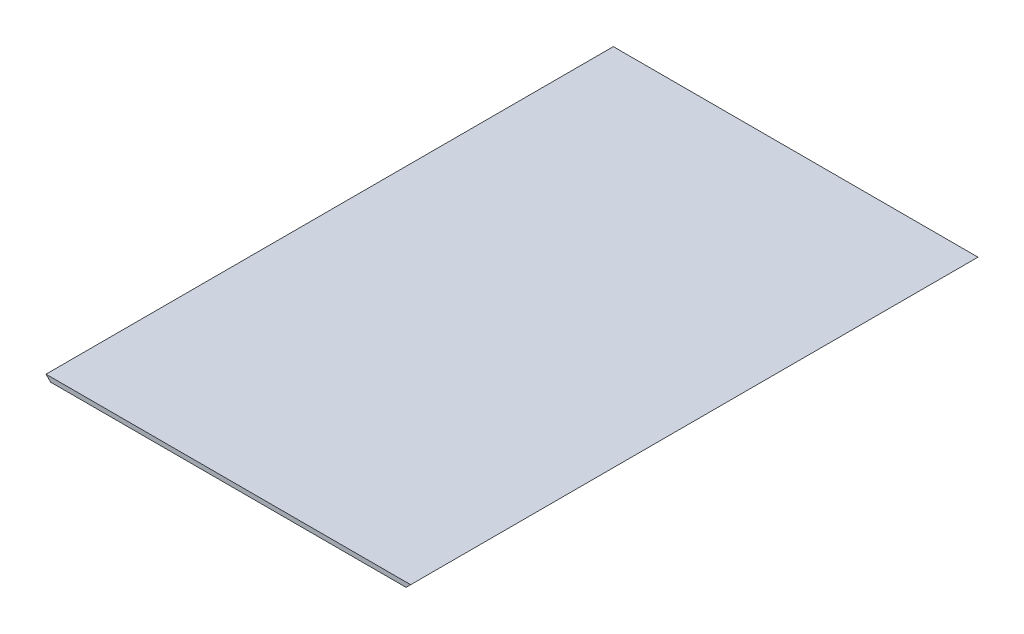
ISO-10303-21;
HEADER;
FILE_DESCRIPTION(('STEP AP214'),'2;1');
FILE_NAME('part.step','',(''),(''),'','','');
FILE_SCHEMA(('AUTOMOTIVE_DESIGN { 1 0 10303 214 1 1 1 1 }'));
ENDSEC;
DATA;
#1=APPLICATION_CONTEXT('core data for automotive mechanical design processes');
#2=APPLICATION_PROTOCOL_DEFINITION('international standard','automotive_design',2000,#1);
#3=PRODUCT_CONTEXT('',#1,'mechanical');
#4=PRODUCT('Part','Part','',(#3));
#5=PRODUCT_RELATED_PRODUCT_CATEGORY('part','',(#4));
#6=PRODUCT_DEFINITION_FORMATION('','',#4);
#7=PRODUCT_DEFINITION_CONTEXT('part definition',#1,'design');
#8=PRODUCT_DEFINITION('design','',#6,#7);
#9=PRODUCT_DEFINITION_SHAPE('','',#8);
#10=(LENGTH_UNIT() NAMED_UNIT(*) SI_UNIT(.MILLI.,.METRE.));
#11=(NAMED_UNIT(*) PLANE_ANGLE_UNIT() SI_UNIT($,.RADIAN.));
#12=(NAMED_UNIT(*) SI_UNIT($,.STERADIAN.) SOLID_ANGLE_UNIT());
#13=UNCERTAINTY_MEASURE_WITH_UNIT(LENGTH_MEASURE(1.E-05),#10,'distance_accuracy_value','');
#14=(GEOMETRIC_REPRESENTATION_CONTEXT(3) GLOBAL_UNCERTAINTY_ASSIGNED_CONTEXT((#13)) GLOBAL_UNIT_ASSIGNED_CONTEXT((#10,
#11,#12)) REPRESENTATION_CONTEXT('',''));
#15=CARTESIAN_POINT('',(0.,0.,0.));
#16=DIRECTION('',(0.,0.,1.));
#17=DIRECTION('',(1.,0.,0.));
#18=AXIS2_PLACEMENT_3D('',#15,#16,#17);
#19=CARTESIAN_POINT('',(631.,16.,984.76));
#20=DIRECTION('',(0.,0.,-1.));
#21=DIRECTION('',(-1.,0.,0.));
#22=AXIS2_PLACEMENT_3D('',#19,#20,#21);
#23=PLANE('',#22);
#24=DIRECTION('',(1.,0.,0.));
#25=VECTOR('',#24,1.);
#26=CARTESIAN_POINT('',(631.,16.,984.76));
#27=LINE('',#26,#25);
#28=CARTESIAN_POINT('',(-631.,16.,984.76));
#29=VERTEX_POINT('',#28);
#30=CARTESIAN_POINT('',(631.,16.,984.76));
#31=VERTEX_POINT('',#30);
#32=EDGE_CURVE('E40',#29,#31,#27,.T.);
#33=ORIENTED_EDGE('',*,*,#32,.F.);
#34=DIRECTION('',(0.707106781186538,-0.707106781186557,0.));
#35=VECTOR('',#34,1.);
#36=CARTESIAN_POINT('',(-631.,16.,984.76));
#37=LINE('',#36,#35);
#38=CARTESIAN_POINT('',(-615.,0.,984.76));
#39=VERTEX_POINT('',#38);
#40=EDGE_CURVE('E86',#29,#39,#37,.T.);
#41=ORIENTED_EDGE('',*,*,#40,.T.);
#42=DIRECTION('',(1.,0.,0.));
#43=VECTOR('',#42,1.);
#44=CARTESIAN_POINT('',(631.,0.,984.76));
#45=LINE('',#44,#43);
#46=CARTESIAN_POINT('',(615.,0.,984.76));
#47=VERTEX_POINT('',#46);
#48=EDGE_CURVE('E54',#39,#47,#45,.T.);
#49=ORIENTED_EDGE('',*,*,#48,.T.);
#50=DIRECTION('',(0.707106781186555,0.70710678118654,0.));
#51=VECTOR('',#50,1.);
#52=CARTESIAN_POINT('',(631.,16.,984.76));
#53=LINE('',#52,#51);
#54=EDGE_CURVE('E98',#47,#31,#53,.T.);
#55=ORIENTED_EDGE('',*,*,#54,.T.);
#56=EDGE_LOOP('',(#33,#41,#49,#55));
#57=FACE_BOUND('',#56,.T.);
#58=ADVANCED_FACE('F33',(#57),#23,.F.);
#59=CARTESIAN_POINT('',(0.,16.,0.));
#60=DIRECTION('',(0.,-1.,0.));
#61=DIRECTION('',(0.,0.,-1.));
#62=AXIS2_PLACEMENT_3D('',#59,#60,#61);
#63=PLANE('',#62);
#64=DIRECTION('',(0.,0.,-1.));
#65=VECTOR('',#64,1.);
#66=CARTESIAN_POINT('',(631.,16.,-984.76));
#67=LINE('',#66,#65);
#68=CARTESIAN_POINT('',(631.,16.,-978.618175439433));
#69=VERTEX_POINT('',#68);
#70=EDGE_CURVE('E83',#31,#69,#67,.T.);
#71=ORIENTED_EDGE('',*,*,#70,.T.);
#72=DIRECTION('',(-1.,0.,0.));
#73=VECTOR('',#72,1.);
#74=CARTESIAN_POINT('',(631.,16.,-978.618175439433));
#75=LINE('',#74,#73);
#76=CARTESIAN_POINT('',(-631.,16.,-978.618175439433));
#77=VERTEX_POINT('',#76);
#78=EDGE_CURVE('E72',#69,#77,#75,.T.);
#79=ORIENTED_EDGE('',*,*,#78,.T.);
#80=DIRECTION('',(0.,0.,1.));
#81=VECTOR('',#80,1.);
#82=CARTESIAN_POINT('',(-631.,16.,984.76));
#83=LINE('',#82,#81);
#84=EDGE_CURVE('E91',#77,#29,#83,.T.);
#85=ORIENTED_EDGE('',*,*,#84,.T.);
#86=ORIENTED_EDGE('',*,*,#32,.T.);
#87=EDGE_LOOP('',(#71,#79,#85,#86));
#88=FACE_BOUND('',#87,.T.);
#89=ADVANCED_FACE('F89',(#88),#63,.F.);
#90=CARTESIAN_POINT('',(0.,0.,0.));
#91=DIRECTION('',(0.,-1.,0.));
#92=DIRECTION('',(0.,0.,-1.));
#93=AXIS2_PLACEMENT_3D('',#90,#91,#92);
#94=PLANE('',#93);
#95=DIRECTION('',(0.,0.,-1.));
#96=VECTOR('',#95,1.);
#97=CARTESIAN_POINT('',(-615.,0.,984.76));
#98=LINE('',#97,#96);
#99=CARTESIAN_POINT('',(-615.,0.,-984.76));
#100=VERTEX_POINT('',#99);
#101=EDGE_CURVE('E99',#39,#100,#98,.T.);
#102=ORIENTED_EDGE('',*,*,#101,.T.);
#103=DIRECTION('',(-1.,0.,0.));
#104=VECTOR('',#103,1.);
#105=CARTESIAN_POINT('',(-631.,0.,-984.76));
#106=LINE('',#105,#104);
#107=CARTESIAN_POINT('',(615.,1.38777878078145E-13,-984.76));
#108=VERTEX_POINT('',#107);
#109=EDGE_CURVE('E47',#108,#100,#106,.T.);
#110=ORIENTED_EDGE('',*,*,#109,.F.);
#111=DIRECTION('',(0.,0.,-1.));
#112=VECTOR('',#111,1.);
#113=CARTESIAN_POINT('',(615.,0.,984.76));
#114=LINE('',#113,#112);
#115=EDGE_CURVE('E85',#47,#108,#114,.T.);
#116=ORIENTED_EDGE('',*,*,#115,.F.);
#117=ORIENTED_EDGE('',*,*,#48,.F.);
#118=EDGE_LOOP('',(#102,#110,#116,#117));
#119=FACE_BOUND('',#118,.T.);
#120=ADVANCED_FACE('F106',(#119),#94,.T.);
#121=CARTESIAN_POINT('',(631.,16.,984.76));
#122=DIRECTION('',(-0.70710678118654,0.707106781186555,0.));
#123=DIRECTION('',(-0.707106781186555,-0.70710678118654,0.));
#124=AXIS2_PLACEMENT_3D('',#121,#122,#123);
#125=PLANE('',#124);
#126=ORIENTED_EDGE('',*,*,#115,.T.);
#127=DIRECTION('',(0.682414773418214,0.682414773418199,0.261954488492094));
#128=VECTOR('',#127,1.);
#129=CARTESIAN_POINT('',(981.976649394272,366.976649394264,-843.890862599738));
#130=LINE('',#129,#128);
#131=EDGE_CURVE('E75',#108,#69,#130,.T.);
#132=ORIENTED_EDGE('',*,*,#131,.T.);
#133=ORIENTED_EDGE('',*,*,#70,.F.);
#134=ORIENTED_EDGE('',*,*,#54,.F.);
#135=EDGE_LOOP('',(#126,#132,#133,#134));
#136=FACE_BOUND('',#135,.T.);
#137=ADVANCED_FACE('F82',(#136),#125,.F.);
#138=CARTESIAN_POINT('',(-631.,16.,984.76));
#139=DIRECTION('',(0.707106781186557,0.707106781186538,0.));
#140=DIRECTION('',(-0.707106781186538,0.707106781186557,0.));
#141=AXIS2_PLACEMENT_3D('',#138,#139,#140);
#142=PLANE('',#141);
#143=ORIENTED_EDGE('',*,*,#84,.F.);
#144=DIRECTION('',(0.682414773418197,-0.682414773418215,-0.2619544884921));
#145=VECTOR('',#144,1.);
#146=CARTESIAN_POINT('',(-981.976649394271,366.97664939428,-843.890862599732));
#147=LINE('',#146,#145);
#148=EDGE_CURVE('E11',#77,#100,#147,.T.);
#149=ORIENTED_EDGE('',*,*,#148,.T.);
#150=ORIENTED_EDGE('',*,*,#101,.F.);
#151=ORIENTED_EDGE('',*,*,#40,.F.);
#152=EDGE_LOOP('',(#143,#149,#150,#151));
#153=FACE_BOUND('',#152,.T.);
#154=ADVANCED_FACE('F107',(#153),#142,.F.);
#155=CARTESIAN_POINT('',(631.,0.,-984.76));
#156=DIRECTION('',(0.,-0.358367949545307,0.933580426497199));
#157=DIRECTION('',(0.,-0.933580426497199,-0.358367949545307));
#158=AXIS2_PLACEMENT_3D('',#155,#156,#157);
#159=PLANE('',#158);
#160=ORIENTED_EDGE('',*,*,#109,.T.);
#161=ORIENTED_EDGE('',*,*,#148,.F.);
#162=ORIENTED_EDGE('',*,*,#78,.F.);
#163=ORIENTED_EDGE('',*,*,#131,.F.);
#164=EDGE_LOOP('',(#160,#161,#162,#163));
#165=FACE_BOUND('',#164,.T.);
#166=ADVANCED_FACE('F74',(#165),#159,.F.);
#167=CLOSED_SHELL('',(#58,#89,#120,#137,#154,#166));
#168=MANIFOLD_SOLID_BREP('B2',#167);
#169=ADVANCED_BREP_SHAPE_REPRESENTATION('',(#18,#168),#14);
#170=SHAPE_DEFINITION_REPRESENTATION(#9,#169);
ENDSEC;
END-ISO-10303-21;
